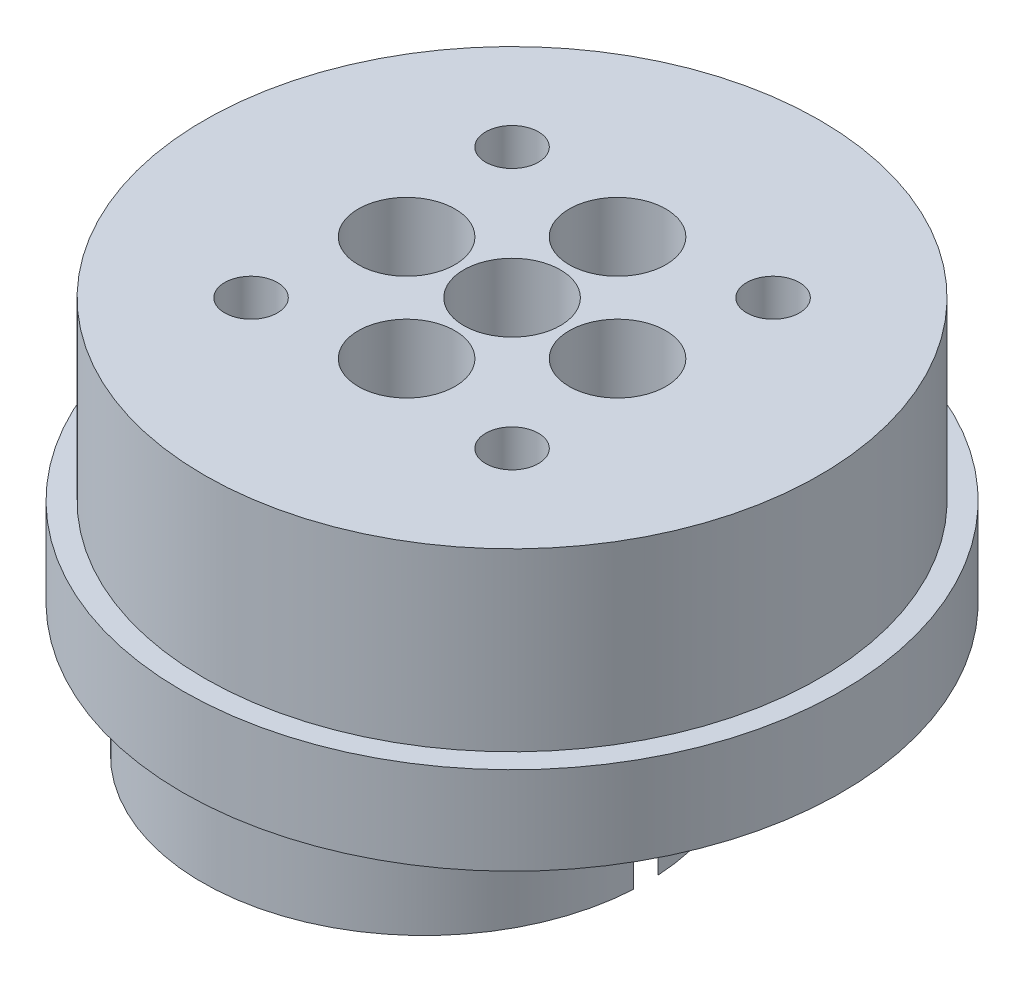
ISO-10303-21;
HEADER;
FILE_DESCRIPTION(('STEP AP214'),'2;1');
FILE_NAME('part.step','',(''),(''),'','','');
FILE_SCHEMA(('AUTOMOTIVE_DESIGN { 1 0 10303 214 1 1 1 1 }'));
ENDSEC;
DATA;
#1=APPLICATION_CONTEXT('core data for automotive mechanical design processes');
#2=APPLICATION_PROTOCOL_DEFINITION('international standard','automotive_design',2000,#1);
#3=PRODUCT_CONTEXT('',#1,'mechanical');
#4=PRODUCT('Part','Part','',(#3));
#5=PRODUCT_RELATED_PRODUCT_CATEGORY('part','',(#4));
#6=PRODUCT_DEFINITION_FORMATION('','',#4);
#7=PRODUCT_DEFINITION_CONTEXT('part definition',#1,'design');
#8=PRODUCT_DEFINITION('design','',#6,#7);
#9=PRODUCT_DEFINITION_SHAPE('','',#8);
#10=(LENGTH_UNIT() NAMED_UNIT(*) SI_UNIT(.MILLI.,.METRE.));
#11=(NAMED_UNIT(*) PLANE_ANGLE_UNIT() SI_UNIT($,.RADIAN.));
#12=(NAMED_UNIT(*) SI_UNIT($,.STERADIAN.) SOLID_ANGLE_UNIT());
#13=UNCERTAINTY_MEASURE_WITH_UNIT(LENGTH_MEASURE(1.E-05),#10,'distance_accuracy_value','');
#14=(GEOMETRIC_REPRESENTATION_CONTEXT(3) GLOBAL_UNCERTAINTY_ASSIGNED_CONTEXT((#13)) GLOBAL_UNIT_ASSIGNED_CONTEXT((#10,
#11,#12)) REPRESENTATION_CONTEXT('',''));
#15=CARTESIAN_POINT('',(0.,0.,0.));
#16=DIRECTION('',(0.,0.,1.));
#17=DIRECTION('',(1.,0.,0.));
#18=AXIS2_PLACEMENT_3D('',#15,#16,#17);
#19=CARTESIAN_POINT('',(-6.,52.778174593052,0.));
#20=DIRECTION('',(0.,-1.,0.));
#21=DIRECTION('',(0.,0.,-1.));
#22=AXIS2_PLACEMENT_3D('',#19,#20,#21);
#23=CYLINDRICAL_SURFACE('',#22,1.75);
#24=CARTESIAN_POINT('',(-6.,20.,0.));
#25=DIRECTION('',(0.,1.,0.));
#26=DIRECTION('',(0.,0.,1.));
#27=AXIS2_PLACEMENT_3D('',#24,#25,#26);
#28=CIRCLE('',#27,1.75);
#29=CARTESIAN_POINT('',(-6.,20.,1.75));
#30=VERTEX_POINT('',#29);
#31=EDGE_CURVE('E72',#30,#30,#28,.T.);
#32=ORIENTED_EDGE('',*,*,#31,.F.);
#33=EDGE_LOOP('',(#32));
#34=FACE_BOUND('',#33,.T.);
#35=CARTESIAN_POINT('',(-6.,41.,0.));
#36=DIRECTION('',(0.,1.,0.));
#37=DIRECTION('',(0.,0.,1.));
#38=AXIS2_PLACEMENT_3D('',#35,#36,#37);
#39=CIRCLE('',#38,1.75);
#40=CARTESIAN_POINT('',(-6.,41.,1.75));
#41=VERTEX_POINT('',#40);
#42=EDGE_CURVE('E43',#41,#41,#39,.F.);
#43=ORIENTED_EDGE('',*,*,#42,.F.);
#44=EDGE_LOOP('',(#43));
#45=FACE_BOUND('',#44,.T.);
#46=ADVANCED_FACE('F39',(#34,#45),#23,.F.);
#47=CARTESIAN_POINT('',(6.,52.778174593052,0.));
#48=DIRECTION('',(0.,-1.,0.));
#49=DIRECTION('',(0.,0.,-1.));
#50=AXIS2_PLACEMENT_3D('',#47,#48,#49);
#51=CYLINDRICAL_SURFACE('',#50,1.75);
#52=DIRECTION('',(0.,-1.,0.));
#53=VECTOR('',#52,1.);
#54=CARTESIAN_POINT('',(7.60582386363637,17.5,-0.695578693589695));
#55=LINE('',#54,#53);
#56=CARTESIAN_POINT('',(7.60582386363637,28.,-0.695578693589695));
#57=VERTEX_POINT('',#56);
#58=CARTESIAN_POINT('',(7.60582386363637,20.,-0.695578693589695));
#59=VERTEX_POINT('',#58);
#60=EDGE_CURVE('E65',#57,#59,#55,.T.);
#61=ORIENTED_EDGE('',*,*,#60,.F.);
#62=CARTESIAN_POINT('',(6.,28.,0.));
#63=DIRECTION('',(0.,-1.,0.));
#64=DIRECTION('',(0.,0.,-1.));
#65=AXIS2_PLACEMENT_3D('',#62,#63,#64);
#66=CIRCLE('',#65,1.75);
#67=CARTESIAN_POINT('',(7.60582386363637,28.,0.695578693589695));
#68=VERTEX_POINT('',#67);
#69=EDGE_CURVE('E119',#57,#68,#66,.T.);
#70=ORIENTED_EDGE('',*,*,#69,.T.);
#71=DIRECTION('',(0.,-1.,0.));
#72=VECTOR('',#71,1.);
#73=CARTESIAN_POINT('',(7.60582386363637,17.5,0.695578693589695));
#74=LINE('',#73,#72);
#75=CARTESIAN_POINT('',(7.60582386363637,20.,0.695578693589693));
#76=VERTEX_POINT('',#75);
#77=EDGE_CURVE('E56',#76,#68,#74,.F.);
#78=ORIENTED_EDGE('',*,*,#77,.F.);
#79=CARTESIAN_POINT('',(6.,20.,0.));
#80=DIRECTION('',(0.,1.,0.));
#81=DIRECTION('',(0.,0.,1.));
#82=AXIS2_PLACEMENT_3D('',#79,#80,#81);
#83=CIRCLE('',#82,1.75);
#84=EDGE_CURVE('E75',#59,#76,#83,.T.);
#85=ORIENTED_EDGE('',*,*,#84,.F.);
#86=EDGE_LOOP('',(#61,#70,#78,#85));
#87=FACE_BOUND('',#86,.T.);
#88=CARTESIAN_POINT('',(6.,41.,0.));
#89=DIRECTION('',(0.,1.,0.));
#90=DIRECTION('',(0.,0.,1.));
#91=AXIS2_PLACEMENT_3D('',#88,#89,#90);
#92=CIRCLE('',#91,1.75);
#93=CARTESIAN_POINT('',(6.,41.,1.75));
#94=VERTEX_POINT('',#93);
#95=EDGE_CURVE('E98',#94,#94,#92,.F.);
#96=ORIENTED_EDGE('',*,*,#95,.F.);
#97=EDGE_LOOP('',(#96));
#98=FACE_BOUND('',#97,.T.);
#99=ADVANCED_FACE('F76',(#87,#98),#51,.F.);
#100=CARTESIAN_POINT('',(0.,52.778174593052,-6.));
#101=DIRECTION('',(0.,-1.,0.));
#102=DIRECTION('',(0.,0.,-1.));
#103=AXIS2_PLACEMENT_3D('',#100,#101,#102);
#104=CYLINDRICAL_SURFACE('',#103,1.75);
#105=CARTESIAN_POINT('',(0.,20.,-6.));
#106=DIRECTION('',(0.,1.,0.));
#107=DIRECTION('',(0.,0.,1.));
#108=AXIS2_PLACEMENT_3D('',#105,#106,#107);
#109=CIRCLE('',#108,1.75);
#110=CARTESIAN_POINT('',(0.,20.,-4.25));
#111=VERTEX_POINT('',#110);
#112=EDGE_CURVE('E79',#111,#111,#109,.T.);
#113=ORIENTED_EDGE('',*,*,#112,.F.);
#114=EDGE_LOOP('',(#113));
#115=FACE_BOUND('',#114,.T.);
#116=CARTESIAN_POINT('',(0.,41.,-6.));
#117=DIRECTION('',(0.,1.,0.));
#118=DIRECTION('',(0.,0.,1.));
#119=AXIS2_PLACEMENT_3D('',#116,#117,#118);
#120=CIRCLE('',#119,1.75);
#121=CARTESIAN_POINT('',(0.,41.,-4.25));
#122=VERTEX_POINT('',#121);
#123=EDGE_CURVE('E95',#122,#122,#120,.F.);
#124=ORIENTED_EDGE('',*,*,#123,.F.);
#125=EDGE_LOOP('',(#124));
#126=FACE_BOUND('',#125,.T.);
#127=ADVANCED_FACE('F183',(#115,#126),#104,.F.);
#128=CARTESIAN_POINT('',(0.,52.778174593052,6.));
#129=DIRECTION('',(0.,-1.,0.));
#130=DIRECTION('',(0.,0.,-1.));
#131=AXIS2_PLACEMENT_3D('',#128,#129,#130);
#132=CYLINDRICAL_SURFACE('',#131,1.75);
#133=CARTESIAN_POINT('',(0.,20.,6.));
#134=DIRECTION('',(0.,1.,0.));
#135=DIRECTION('',(0.,0.,1.));
#136=AXIS2_PLACEMENT_3D('',#133,#134,#135);
#137=CIRCLE('',#136,1.75);
#138=CARTESIAN_POINT('',(0.,20.,7.75));
#139=VERTEX_POINT('',#138);
#140=EDGE_CURVE('E140',#139,#139,#137,.T.);
#141=ORIENTED_EDGE('',*,*,#140,.F.);
#142=EDGE_LOOP('',(#141));
#143=FACE_BOUND('',#142,.T.);
#144=CARTESIAN_POINT('',(0.,41.,6.));
#145=DIRECTION('',(0.,1.,0.));
#146=DIRECTION('',(0.,0.,1.));
#147=AXIS2_PLACEMENT_3D('',#144,#145,#146);
#148=CIRCLE('',#147,1.75);
#149=CARTESIAN_POINT('',(0.,41.,7.75));
#150=VERTEX_POINT('',#149);
#151=EDGE_CURVE('E92',#150,#150,#148,.F.);
#152=ORIENTED_EDGE('',*,*,#151,.F.);
#153=EDGE_LOOP('',(#152));
#154=FACE_BOUND('',#153,.T.);
#155=ADVANCED_FACE('F155',(#143,#154),#132,.F.);
#156=CARTESIAN_POINT('',(0.,30.,0.));
#157=DIRECTION('',(0.,1.,0.));
#158=DIRECTION('',(0.,0.,1.));
#159=AXIS2_PLACEMENT_3D('',#156,#157,#158);
#160=PLANE('',#159);
#161=CARTESIAN_POINT('',(0.,30.,0.));
#162=DIRECTION('',(0.,1.,0.));
#163=DIRECTION('',(0.,0.,1.));
#164=AXIS2_PLACEMENT_3D('',#161,#162,#163);
#165=CIRCLE('',#164,18.75);
#166=CARTESIAN_POINT('',(0.,30.,18.75));
#167=VERTEX_POINT('',#166);
#168=EDGE_CURVE('E88',#167,#167,#165,.T.);
#169=ORIENTED_EDGE('',*,*,#168,.F.);
#170=EDGE_LOOP('',(#169));
#171=FACE_BOUND('',#170,.T.);
#172=CARTESIAN_POINT('',(-5.,30.,0.));
#173=DIRECTION('',(0.,1.,0.));
#174=DIRECTION('',(0.,0.,1.));
#175=AXIS2_PLACEMENT_3D('',#172,#173,#174);
#176=CIRCLE('',#175,13.);
#177=CARTESIAN_POINT('',(-5.,30.,13.));
#178=VERTEX_POINT('',#177);
#179=EDGE_CURVE('E11',#178,#178,#176,.F.);
#180=ORIENTED_EDGE('',*,*,#179,.F.);
#181=EDGE_LOOP('',(#180));
#182=FACE_BOUND('',#181,.T.);
#183=ADVANCED_FACE('F152',(#171,#182),#160,.F.);
#184=CARTESIAN_POINT('',(-5.,30.,0.));
#185=DIRECTION('',(0.,-1.,0.));
#186=DIRECTION('',(0.,0.,-1.));
#187=AXIS2_PLACEMENT_3D('',#184,#185,#186);
#188=CYLINDRICAL_SURFACE('',#187,12.625);
#189=ORIENTED_EDGE('',*,*,#77,.T.);
#190=CARTESIAN_POINT('',(-5.,28.,0.));
#191=DIRECTION('',(0.,-1.,0.));
#192=DIRECTION('',(0.,0.,-1.));
#193=AXIS2_PLACEMENT_3D('',#190,#191,#192);
#194=CIRCLE('',#193,12.625);
#195=EDGE_CURVE('E60',#68,#57,#194,.T.);
#196=ORIENTED_EDGE('',*,*,#195,.T.);
#197=ORIENTED_EDGE('',*,*,#60,.T.);
#198=CARTESIAN_POINT('',(-5.,20.,0.));
#199=DIRECTION('',(0.,1.,0.));
#200=DIRECTION('',(0.,0.,1.));
#201=AXIS2_PLACEMENT_3D('',#198,#199,#200);
#202=CIRCLE('',#201,12.625);
#203=EDGE_CURVE('E68',#59,#76,#202,.T.);
#204=ORIENTED_EDGE('',*,*,#203,.T.);
#205=EDGE_LOOP('',(#189,#196,#197,#204));
#206=FACE_BOUND('',#205,.T.);
#207=ADVANCED_FACE('F41',(#206),#188,.T.);
#208=CARTESIAN_POINT('',(-5.,20.,0.));
#209=DIRECTION('',(0.,1.,0.));
#210=DIRECTION('',(0.,0.,1.));
#211=AXIS2_PLACEMENT_3D('',#208,#209,#210);
#212=PLANE('',#211);
#213=ORIENTED_EDGE('',*,*,#140,.T.);
#214=EDGE_LOOP('',(#213));
#215=FACE_BOUND('',#214,.T.);
#216=ORIENTED_EDGE('',*,*,#112,.T.);
#217=EDGE_LOOP('',(#216));
#218=FACE_BOUND('',#217,.T.);
#219=ORIENTED_EDGE('',*,*,#203,.F.);
#220=ORIENTED_EDGE('',*,*,#84,.T.);
#221=EDGE_LOOP('',(#219,#220));
#222=FACE_BOUND('',#221,.T.);
#223=ORIENTED_EDGE('',*,*,#31,.T.);
#224=EDGE_LOOP('',(#223));
#225=FACE_BOUND('',#224,.T.);
#226=CARTESIAN_POINT('',(0.,20.,0.));
#227=DIRECTION('',(0.,1.,0.));
#228=DIRECTION('',(0.,0.,1.));
#229=AXIS2_PLACEMENT_3D('',#226,#227,#228);
#230=CIRCLE('',#229,2.75);
#231=CARTESIAN_POINT('',(0.,20.,2.75));
#232=VERTEX_POINT('',#231);
#233=EDGE_CURVE('E129',#232,#232,#230,.F.);
#234=ORIENTED_EDGE('',*,*,#233,.F.);
#235=EDGE_LOOP('',(#234));
#236=FACE_BOUND('',#235,.T.);
#237=ADVANCED_FACE('F81',(#215,#218,#222,#225,#236),#212,.F.);
#238=CARTESIAN_POINT('',(0.,35.,0.));
#239=DIRECTION('',(0.,-1.,0.));
#240=DIRECTION('',(0.,0.,-1.));
#241=AXIS2_PLACEMENT_3D('',#238,#239,#240);
#242=CYLINDRICAL_SURFACE('',#241,18.75);
#243=CARTESIAN_POINT('',(0.,35.,0.));
#244=DIRECTION('',(0.,1.,0.));
#245=DIRECTION('',(0.,0.,1.));
#246=AXIS2_PLACEMENT_3D('',#243,#244,#245);
#247=CIRCLE('',#246,18.75);
#248=CARTESIAN_POINT('',(0.,35.,18.75));
#249=VERTEX_POINT('',#248);
#250=EDGE_CURVE('E83',#249,#249,#247,.T.);
#251=ORIENTED_EDGE('',*,*,#250,.F.);
#252=EDGE_LOOP('',(#251));
#253=FACE_BOUND('',#252,.T.);
#254=ORIENTED_EDGE('',*,*,#168,.T.);
#255=EDGE_LOOP('',(#254));
#256=FACE_BOUND('',#255,.T.);
#257=ADVANCED_FACE('F150',(#253,#256),#242,.T.);
#258=CARTESIAN_POINT('',(0.,35.,0.));
#259=DIRECTION('',(0.,1.,0.));
#260=DIRECTION('',(0.,0.,1.));
#261=AXIS2_PLACEMENT_3D('',#258,#259,#260);
#262=PLANE('',#261);
#263=CARTESIAN_POINT('',(0.,35.,0.));
#264=DIRECTION('',(0.,1.,0.));
#265=DIRECTION('',(0.,0.,1.));
#266=AXIS2_PLACEMENT_3D('',#263,#264,#265);
#267=CIRCLE('',#266,17.5);
#268=CARTESIAN_POINT('',(0.,35.,17.5));
#269=VERTEX_POINT('',#268);
#270=EDGE_CURVE('E48',#269,#269,#267,.T.);
#271=ORIENTED_EDGE('',*,*,#270,.F.);
#272=EDGE_LOOP('',(#271));
#273=FACE_BOUND('',#272,.T.);
#274=ORIENTED_EDGE('',*,*,#250,.T.);
#275=EDGE_LOOP('',(#274));
#276=FACE_BOUND('',#275,.T.);
#277=ADVANCED_FACE('F203',(#273,#276),#262,.T.);
#278=CARTESIAN_POINT('',(0.,45.,0.));
#279=DIRECTION('',(0.,-1.,0.));
#280=DIRECTION('',(0.,0.,-1.));
#281=AXIS2_PLACEMENT_3D('',#278,#279,#280);
#282=CYLINDRICAL_SURFACE('',#281,17.5);
#283=CARTESIAN_POINT('',(0.,45.,0.));
#284=DIRECTION('',(0.,1.,0.));
#285=DIRECTION('',(0.,0.,1.));
#286=AXIS2_PLACEMENT_3D('',#283,#284,#285);
#287=CIRCLE('',#286,17.5);
#288=CARTESIAN_POINT('',(0.,45.,17.5));
#289=VERTEX_POINT('',#288);
#290=EDGE_CURVE('E143',#289,#289,#287,.T.);
#291=ORIENTED_EDGE('',*,*,#290,.F.);
#292=EDGE_LOOP('',(#291));
#293=FACE_BOUND('',#292,.T.);
#294=ORIENTED_EDGE('',*,*,#270,.T.);
#295=EDGE_LOOP('',(#294));
#296=FACE_BOUND('',#295,.T.);
#297=ADVANCED_FACE('F199',(#293,#296),#282,.T.);
#298=CARTESIAN_POINT('',(0.,45.,0.));
#299=DIRECTION('',(0.,1.,0.));
#300=DIRECTION('',(0.,0.,1.));
#301=AXIS2_PLACEMENT_3D('',#298,#299,#300);
#302=PLANE('',#301);
#303=CARTESIAN_POINT('',(-6.,45.,0.));
#304=DIRECTION('',(0.,1.,0.));
#305=DIRECTION('',(0.,0.,1.));
#306=AXIS2_PLACEMENT_3D('',#303,#304,#305);
#307=CIRCLE('',#306,2.75);
#308=CARTESIAN_POINT('',(-6.,45.,2.75));
#309=VERTEX_POINT('',#308);
#310=EDGE_CURVE('E370',#309,#309,#307,.T.);
#311=ORIENTED_EDGE('',*,*,#310,.F.);
#312=EDGE_LOOP('',(#311));
#313=FACE_BOUND('',#312,.T.);
#314=CARTESIAN_POINT('',(0.,45.,-6.));
#315=DIRECTION('',(0.,1.,0.));
#316=DIRECTION('',(0.,0.,1.));
#317=AXIS2_PLACEMENT_3D('',#314,#315,#316);
#318=CIRCLE('',#317,2.75);
#319=CARTESIAN_POINT('',(0.,45.,-3.25));
#320=VERTEX_POINT('',#319);
#321=EDGE_CURVE('E374',#320,#320,#318,.T.);
#322=ORIENTED_EDGE('',*,*,#321,.F.);
#323=EDGE_LOOP('',(#322));
#324=FACE_BOUND('',#323,.T.);
#325=CARTESIAN_POINT('',(6.,45.,0.));
#326=DIRECTION('',(0.,1.,0.));
#327=DIRECTION('',(0.,0.,1.));
#328=AXIS2_PLACEMENT_3D('',#325,#326,#327);
#329=CIRCLE('',#328,2.75);
#330=CARTESIAN_POINT('',(6.,45.,2.75));
#331=VERTEX_POINT('',#330);
#332=EDGE_CURVE('E382',#331,#331,#329,.T.);
#333=ORIENTED_EDGE('',*,*,#332,.F.);
#334=EDGE_LOOP('',(#333));
#335=FACE_BOUND('',#334,.T.);
#336=CARTESIAN_POINT('',(0.,45.,6.));
#337=DIRECTION('',(0.,1.,0.));
#338=DIRECTION('',(0.,0.,1.));
#339=AXIS2_PLACEMENT_3D('',#336,#337,#338);
#340=CIRCLE('',#339,2.75);
#341=CARTESIAN_POINT('',(0.,45.,8.75));
#342=VERTEX_POINT('',#341);
#343=EDGE_CURVE('E388',#342,#342,#340,.T.);
#344=ORIENTED_EDGE('',*,*,#343,.F.);
#345=EDGE_LOOP('',(#344));
#346=FACE_BOUND('',#345,.T.);
#347=CARTESIAN_POINT('',(-7.42462120245873,45.,7.42462120245876));
#348=DIRECTION('',(0.,1.,0.));
#349=DIRECTION('',(0.,0.,1.));
#350=AXIS2_PLACEMENT_3D('',#347,#348,#349);
#351=CIRCLE('',#350,1.5);
#352=CARTESIAN_POINT('',(-7.42462120245873,45.,8.92462120245876));
#353=VERTEX_POINT('',#352);
#354=EDGE_CURVE('E103',#353,#353,#351,.T.);
#355=ORIENTED_EDGE('',*,*,#354,.F.);
#356=EDGE_LOOP('',(#355));
#357=FACE_BOUND('',#356,.T.);
#358=CARTESIAN_POINT('',(7.42462120245876,45.,7.42462120245873));
#359=DIRECTION('',(0.,1.,0.));
#360=DIRECTION('',(0.,0.,1.));
#361=AXIS2_PLACEMENT_3D('',#358,#359,#360);
#362=CIRCLE('',#361,1.5);
#363=CARTESIAN_POINT('',(7.42462120245876,45.,8.92462120245873));
#364=VERTEX_POINT('',#363);
#365=EDGE_CURVE('E112',#364,#364,#362,.T.);
#366=ORIENTED_EDGE('',*,*,#365,.F.);
#367=EDGE_LOOP('',(#366));
#368=FACE_BOUND('',#367,.T.);
#369=CARTESIAN_POINT('',(7.42462120245874,45.,-7.42462120245876));
#370=DIRECTION('',(0.,1.,0.));
#371=DIRECTION('',(0.,0.,1.));
#372=AXIS2_PLACEMENT_3D('',#369,#370,#371);
#373=CIRCLE('',#372,1.5);
#374=CARTESIAN_POINT('',(7.42462120245874,45.,-5.92462120245876));
#375=VERTEX_POINT('',#374);
#376=EDGE_CURVE('E393',#375,#375,#373,.T.);
#377=ORIENTED_EDGE('',*,*,#376,.F.);
#378=EDGE_LOOP('',(#377));
#379=FACE_BOUND('',#378,.T.);
#380=CARTESIAN_POINT('',(-7.42462120245876,45.,-7.42462120245874));
#381=DIRECTION('',(0.,1.,0.));
#382=DIRECTION('',(0.,0.,1.));
#383=AXIS2_PLACEMENT_3D('',#380,#381,#382);
#384=CIRCLE('',#383,1.5);
#385=CARTESIAN_POINT('',(-7.42462120245876,45.,-5.92462120245874));
#386=VERTEX_POINT('',#385);
#387=EDGE_CURVE('E120',#386,#386,#384,.T.);
#388=ORIENTED_EDGE('',*,*,#387,.F.);
#389=EDGE_LOOP('',(#388));
#390=FACE_BOUND('',#389,.T.);
#391=CARTESIAN_POINT('',(0.,45.,0.));
#392=DIRECTION('',(0.,1.,0.));
#393=DIRECTION('',(0.,0.,1.));
#394=AXIS2_PLACEMENT_3D('',#391,#392,#393);
#395=CIRCLE('',#394,2.75);
#396=CARTESIAN_POINT('',(0.,45.,2.75));
#397=VERTEX_POINT('',#396);
#398=EDGE_CURVE('E132',#397,#397,#395,.F.);
#399=ORIENTED_EDGE('',*,*,#398,.T.);
#400=EDGE_LOOP('',(#399));
#401=FACE_BOUND('',#400,.T.);
#402=ORIENTED_EDGE('',*,*,#290,.T.);
#403=EDGE_LOOP('',(#402));
#404=FACE_BOUND('',#403,.T.);
#405=ADVANCED_FACE('F195',(#313,#324,#335,#346,#357,#368,#379,#390,#401,#404),#302,.T.);
#406=CARTESIAN_POINT('',(0.,52.778174593052,0.));
#407=DIRECTION('',(0.,-1.,0.));
#408=DIRECTION('',(0.,0.,-1.));
#409=AXIS2_PLACEMENT_3D('',#406,#407,#408);
#410=CYLINDRICAL_SURFACE('',#409,2.75);
#411=ORIENTED_EDGE('',*,*,#233,.T.);
#412=EDGE_LOOP('',(#411));
#413=FACE_BOUND('',#412,.T.);
#414=ORIENTED_EDGE('',*,*,#398,.F.);
#415=EDGE_LOOP('',(#414));
#416=FACE_BOUND('',#415,.T.);
#417=ADVANCED_FACE('F172',(#413,#416),#410,.F.);
#418=CARTESIAN_POINT('',(-5.,28.,0.));
#419=DIRECTION('',(0.,-1.,0.));
#420=DIRECTION('',(0.,0.,-1.));
#421=AXIS2_PLACEMENT_3D('',#418,#419,#420);
#422=PLANE('',#421);
#423=CARTESIAN_POINT('',(-5.,28.,0.));
#424=DIRECTION('',(0.,-1.,0.));
#425=DIRECTION('',(0.,0.,-1.));
#426=AXIS2_PLACEMENT_3D('',#423,#424,#425);
#427=CIRCLE('',#426,13.);
#428=CARTESIAN_POINT('',(-5.,28.,-13.));
#429=VERTEX_POINT('',#428);
#430=EDGE_CURVE('E125',#429,#429,#427,.T.);
#431=ORIENTED_EDGE('',*,*,#430,.T.);
#432=EDGE_LOOP('',(#431));
#433=FACE_BOUND('',#432,.T.);
#434=ORIENTED_EDGE('',*,*,#195,.F.);
#435=ORIENTED_EDGE('',*,*,#69,.F.);
#436=EDGE_LOOP('',(#434,#435));
#437=FACE_BOUND('',#436,.T.);
#438=ADVANCED_FACE('F162',(#433,#437),#422,.T.);
#439=CARTESIAN_POINT('',(-5.,28.,0.));
#440=DIRECTION('',(0.,1.,0.));
#441=DIRECTION('',(0.,0.,1.));
#442=AXIS2_PLACEMENT_3D('',#439,#440,#441);
#443=CYLINDRICAL_SURFACE('',#442,13.);
#444=ORIENTED_EDGE('',*,*,#430,.F.);
#445=EDGE_LOOP('',(#444));
#446=FACE_BOUND('',#445,.T.);
#447=ORIENTED_EDGE('',*,*,#179,.T.);
#448=EDGE_LOOP('',(#447));
#449=FACE_BOUND('',#448,.T.);
#450=ADVANCED_FACE('F159',(#446,#449),#443,.T.);
#451=CARTESIAN_POINT('',(-7.42462120245876,35.,-7.42462120245874));
#452=DIRECTION('',(0.,1.,0.));
#453=DIRECTION('',(0.,0.,1.));
#454=AXIS2_PLACEMENT_3D('',#451,#452,#453);
#455=CYLINDRICAL_SURFACE('',#454,1.5);
#456=CARTESIAN_POINT('',(-7.42462120245876,35.,-7.42462120245874));
#457=DIRECTION('',(0.,1.,0.));
#458=DIRECTION('',(0.,0.,1.));
#459=AXIS2_PLACEMENT_3D('',#456,#457,#458);
#460=CIRCLE('',#459,1.5);
#461=CARTESIAN_POINT('',(-7.42462120245876,35.,-5.92462120245874));
#462=VERTEX_POINT('',#461);
#463=EDGE_CURVE('E116',#462,#462,#460,.T.);
#464=ORIENTED_EDGE('',*,*,#463,.F.);
#465=EDGE_LOOP('',(#464));
#466=FACE_BOUND('',#465,.T.);
#467=ORIENTED_EDGE('',*,*,#387,.T.);
#468=EDGE_LOOP('',(#467));
#469=FACE_BOUND('',#468,.T.);
#470=ADVANCED_FACE('F161',(#466,#469),#455,.F.);
#471=CARTESIAN_POINT('',(-7.42462120245876,35.,-7.42462120245874));
#472=DIRECTION('',(0.,1.,0.));
#473=DIRECTION('',(0.,0.,1.));
#474=AXIS2_PLACEMENT_3D('',#471,#472,#473);
#475=PLANE('',#474);
#476=ORIENTED_EDGE('',*,*,#463,.T.);
#477=EDGE_LOOP('',(#476));
#478=FACE_BOUND('',#477,.T.);
#479=ADVANCED_FACE('F169',(#478),#475,.T.);
#480=CARTESIAN_POINT('',(7.42462120245874,35.,-7.42462120245876));
#481=DIRECTION('',(0.,1.,0.));
#482=DIRECTION('',(0.,0.,1.));
#483=AXIS2_PLACEMENT_3D('',#480,#481,#482);
#484=CYLINDRICAL_SURFACE('',#483,1.5);
#485=CARTESIAN_POINT('',(7.42462120245874,35.,-7.42462120245876));
#486=DIRECTION('',(0.,1.,0.));
#487=DIRECTION('',(0.,0.,1.));
#488=AXIS2_PLACEMENT_3D('',#485,#486,#487);
#489=CIRCLE('',#488,1.5);
#490=CARTESIAN_POINT('',(7.42462120245874,35.,-5.92462120245876));
#491=VERTEX_POINT('',#490);
#492=EDGE_CURVE('E123',#491,#491,#489,.T.);
#493=ORIENTED_EDGE('',*,*,#492,.F.);
#494=EDGE_LOOP('',(#493));
#495=FACE_BOUND('',#494,.T.);
#496=ORIENTED_EDGE('',*,*,#376,.T.);
#497=EDGE_LOOP('',(#496));
#498=FACE_BOUND('',#497,.T.);
#499=ADVANCED_FACE('F258',(#495,#498),#484,.F.);
#500=CARTESIAN_POINT('',(7.42462120245874,35.,-7.42462120245876));
#501=DIRECTION('',(0.,1.,0.));
#502=DIRECTION('',(0.,0.,1.));
#503=AXIS2_PLACEMENT_3D('',#500,#501,#502);
#504=PLANE('',#503);
#505=ORIENTED_EDGE('',*,*,#492,.T.);
#506=EDGE_LOOP('',(#505));
#507=FACE_BOUND('',#506,.T.);
#508=ADVANCED_FACE('F254',(#507),#504,.T.);
#509=CARTESIAN_POINT('',(7.42462120245876,35.,7.42462120245873));
#510=DIRECTION('',(0.,1.,0.));
#511=DIRECTION('',(0.,0.,1.));
#512=AXIS2_PLACEMENT_3D('',#509,#510,#511);
#513=CYLINDRICAL_SURFACE('',#512,1.5);
#514=CARTESIAN_POINT('',(7.42462120245876,35.,7.42462120245873));
#515=DIRECTION('',(0.,1.,0.));
#516=DIRECTION('',(0.,0.,1.));
#517=AXIS2_PLACEMENT_3D('',#514,#515,#516);
#518=CIRCLE('',#517,1.5);
#519=CARTESIAN_POINT('',(7.42462120245876,35.,8.92462120245873));
#520=VERTEX_POINT('',#519);
#521=EDGE_CURVE('E396',#520,#520,#518,.T.);
#522=ORIENTED_EDGE('',*,*,#521,.F.);
#523=EDGE_LOOP('',(#522));
#524=FACE_BOUND('',#523,.T.);
#525=ORIENTED_EDGE('',*,*,#365,.T.);
#526=EDGE_LOOP('',(#525));
#527=FACE_BOUND('',#526,.T.);
#528=ADVANCED_FACE('F257',(#524,#527),#513,.F.);
#529=CARTESIAN_POINT('',(7.42462120245876,35.,7.42462120245873));
#530=DIRECTION('',(0.,1.,0.));
#531=DIRECTION('',(0.,0.,1.));
#532=AXIS2_PLACEMENT_3D('',#529,#530,#531);
#533=PLANE('',#532);
#534=ORIENTED_EDGE('',*,*,#521,.T.);
#535=EDGE_LOOP('',(#534));
#536=FACE_BOUND('',#535,.T.);
#537=ADVANCED_FACE('F263',(#536),#533,.T.);
#538=CARTESIAN_POINT('',(-7.42462120245873,35.,7.42462120245876));
#539=DIRECTION('',(0.,1.,0.));
#540=DIRECTION('',(0.,0.,1.));
#541=AXIS2_PLACEMENT_3D('',#538,#539,#540);
#542=CYLINDRICAL_SURFACE('',#541,1.5);
#543=CARTESIAN_POINT('',(-7.42462120245873,35.,7.42462120245876));
#544=DIRECTION('',(0.,1.,0.));
#545=DIRECTION('',(0.,0.,1.));
#546=AXIS2_PLACEMENT_3D('',#543,#544,#545);
#547=CIRCLE('',#546,1.5);
#548=CARTESIAN_POINT('',(-7.42462120245873,35.,8.92462120245876));
#549=VERTEX_POINT('',#548);
#550=EDGE_CURVE('E107',#549,#549,#547,.T.);
#551=ORIENTED_EDGE('',*,*,#550,.F.);
#552=EDGE_LOOP('',(#551));
#553=FACE_BOUND('',#552,.T.);
#554=ORIENTED_EDGE('',*,*,#354,.T.);
#555=EDGE_LOOP('',(#554));
#556=FACE_BOUND('',#555,.T.);
#557=ADVANCED_FACE('F266',(#553,#556),#542,.F.);
#558=CARTESIAN_POINT('',(-7.42462120245873,35.,7.42462120245876));
#559=DIRECTION('',(0.,1.,0.));
#560=DIRECTION('',(0.,0.,1.));
#561=AXIS2_PLACEMENT_3D('',#558,#559,#560);
#562=PLANE('',#561);
#563=ORIENTED_EDGE('',*,*,#550,.T.);
#564=EDGE_LOOP('',(#563));
#565=FACE_BOUND('',#564,.T.);
#566=ADVANCED_FACE('F251',(#565),#562,.T.);
#567=CARTESIAN_POINT('',(0.,41.,6.));
#568=DIRECTION('',(0.,1.,0.));
#569=DIRECTION('',(0.,0.,1.));
#570=AXIS2_PLACEMENT_3D('',#567,#568,#569);
#571=PLANE('',#570);
#572=CARTESIAN_POINT('',(0.,41.,6.));
#573=DIRECTION('',(0.,1.,0.));
#574=DIRECTION('',(0.,0.,1.));
#575=AXIS2_PLACEMENT_3D('',#572,#573,#574);
#576=CIRCLE('',#575,2.75);
#577=CARTESIAN_POINT('',(0.,41.,8.75));
#578=VERTEX_POINT('',#577);
#579=EDGE_CURVE('E385',#578,#578,#576,.T.);
#580=ORIENTED_EDGE('',*,*,#579,.T.);
#581=EDGE_LOOP('',(#580));
#582=FACE_BOUND('',#581,.T.);
#583=ORIENTED_EDGE('',*,*,#151,.T.);
#584=EDGE_LOOP('',(#583));
#585=FACE_BOUND('',#584,.T.);
#586=ADVANCED_FACE('F234',(#582,#585),#571,.T.);
#587=CARTESIAN_POINT('',(0.,41.,6.));
#588=DIRECTION('',(0.,1.,0.));
#589=DIRECTION('',(0.,0.,1.));
#590=AXIS2_PLACEMENT_3D('',#587,#588,#589);
#591=CYLINDRICAL_SURFACE('',#590,2.75);
#592=ORIENTED_EDGE('',*,*,#579,.F.);
#593=EDGE_LOOP('',(#592));
#594=FACE_BOUND('',#593,.T.);
#595=ORIENTED_EDGE('',*,*,#343,.T.);
#596=EDGE_LOOP('',(#595));
#597=FACE_BOUND('',#596,.T.);
#598=ADVANCED_FACE('F224',(#594,#597),#591,.F.);
#599=CARTESIAN_POINT('',(0.,41.,-6.));
#600=DIRECTION('',(0.,1.,0.));
#601=DIRECTION('',(0.,0.,1.));
#602=AXIS2_PLACEMENT_3D('',#599,#600,#601);
#603=PLANE('',#602);
#604=CARTESIAN_POINT('',(0.,41.,-6.));
#605=DIRECTION('',(0.,1.,0.));
#606=DIRECTION('',(0.,0.,1.));
#607=AXIS2_PLACEMENT_3D('',#604,#605,#606);
#608=CIRCLE('',#607,2.75);
#609=CARTESIAN_POINT('',(0.,41.,-3.25));
#610=VERTEX_POINT('',#609);
#611=EDGE_CURVE('E371',#610,#610,#608,.T.);
#612=ORIENTED_EDGE('',*,*,#611,.T.);
#613=EDGE_LOOP('',(#612));
#614=FACE_BOUND('',#613,.T.);
#615=ORIENTED_EDGE('',*,*,#123,.T.);
#616=EDGE_LOOP('',(#615));
#617=FACE_BOUND('',#616,.T.);
#618=ADVANCED_FACE('F221',(#614,#617),#603,.T.);
#619=CARTESIAN_POINT('',(0.,41.,-6.));
#620=DIRECTION('',(0.,1.,0.));
#621=DIRECTION('',(0.,0.,1.));
#622=AXIS2_PLACEMENT_3D('',#619,#620,#621);
#623=CYLINDRICAL_SURFACE('',#622,2.75);
#624=ORIENTED_EDGE('',*,*,#611,.F.);
#625=EDGE_LOOP('',(#624));
#626=FACE_BOUND('',#625,.T.);
#627=ORIENTED_EDGE('',*,*,#321,.T.);
#628=EDGE_LOOP('',(#627));
#629=FACE_BOUND('',#628,.T.);
#630=ADVANCED_FACE('F223',(#626,#629),#623,.F.);
#631=CARTESIAN_POINT('',(6.,41.,0.));
#632=DIRECTION('',(0.,1.,0.));
#633=DIRECTION('',(0.,0.,1.));
#634=AXIS2_PLACEMENT_3D('',#631,#632,#633);
#635=PLANE('',#634);
#636=CARTESIAN_POINT('',(6.,41.,0.));
#637=DIRECTION('',(0.,1.,0.));
#638=DIRECTION('',(0.,0.,1.));
#639=AXIS2_PLACEMENT_3D('',#636,#637,#638);
#640=CIRCLE('',#639,2.75);
#641=CARTESIAN_POINT('',(6.,41.,2.75));
#642=VERTEX_POINT('',#641);
#643=EDGE_CURVE('E379',#642,#642,#640,.T.);
#644=ORIENTED_EDGE('',*,*,#643,.T.);
#645=EDGE_LOOP('',(#644));
#646=FACE_BOUND('',#645,.T.);
#647=ORIENTED_EDGE('',*,*,#95,.T.);
#648=EDGE_LOOP('',(#647));
#649=FACE_BOUND('',#648,.T.);
#650=ADVANCED_FACE('F231',(#646,#649),#635,.T.);
#651=CARTESIAN_POINT('',(6.,41.,0.));
#652=DIRECTION('',(0.,1.,0.));
#653=DIRECTION('',(0.,0.,1.));
#654=AXIS2_PLACEMENT_3D('',#651,#652,#653);
#655=CYLINDRICAL_SURFACE('',#654,2.75);
#656=ORIENTED_EDGE('',*,*,#643,.F.);
#657=EDGE_LOOP('',(#656));
#658=FACE_BOUND('',#657,.T.);
#659=ORIENTED_EDGE('',*,*,#332,.T.);
#660=EDGE_LOOP('',(#659));
#661=FACE_BOUND('',#660,.T.);
#662=ADVANCED_FACE('F244',(#658,#661),#655,.F.);
#663=CARTESIAN_POINT('',(-6.,41.,0.));
#664=DIRECTION('',(0.,1.,0.));
#665=DIRECTION('',(0.,0.,1.));
#666=AXIS2_PLACEMENT_3D('',#663,#664,#665);
#667=PLANE('',#666);
#668=CARTESIAN_POINT('',(-6.,41.,0.));
#669=DIRECTION('',(0.,1.,0.));
#670=DIRECTION('',(0.,0.,1.));
#671=AXIS2_PLACEMENT_3D('',#668,#669,#670);
#672=CIRCLE('',#671,2.75);
#673=CARTESIAN_POINT('',(-6.,41.,2.75));
#674=VERTEX_POINT('',#673);
#675=EDGE_CURVE('E96',#674,#674,#672,.T.);
#676=ORIENTED_EDGE('',*,*,#675,.T.);
#677=EDGE_LOOP('',(#676));
#678=FACE_BOUND('',#677,.T.);
#679=ORIENTED_EDGE('',*,*,#42,.T.);
#680=EDGE_LOOP('',(#679));
#681=FACE_BOUND('',#680,.T.);
#682=ADVANCED_FACE('F248',(#678,#681),#667,.T.);
#683=CARTESIAN_POINT('',(-6.,41.,0.));
#684=DIRECTION('',(0.,1.,0.));
#685=DIRECTION('',(0.,0.,1.));
#686=AXIS2_PLACEMENT_3D('',#683,#684,#685);
#687=CYLINDRICAL_SURFACE('',#686,2.75);
#688=ORIENTED_EDGE('',*,*,#675,.F.);
#689=EDGE_LOOP('',(#688));
#690=FACE_BOUND('',#689,.T.);
#691=ORIENTED_EDGE('',*,*,#310,.T.);
#692=EDGE_LOOP('',(#691));
#693=FACE_BOUND('',#692,.T.);
#694=ADVANCED_FACE('F239',(#690,#693),#687,.F.);
#695=CLOSED_SHELL('',(#46,#99,#127,#155,#183,#207,#237,#257,#277,#297,#405,#417,#438,#450,#470,
#479,#499,#508,#528,#537,#557,#566,#586,#598,#618,#630,#650,#662,#682,#694));
#696=MANIFOLD_SOLID_BREP('B2',#695);
#697=ADVANCED_BREP_SHAPE_REPRESENTATION('',(#18,#696),#14);
#698=SHAPE_DEFINITION_REPRESENTATION(#9,#697);
ENDSEC;
END-ISO-10303-21;
